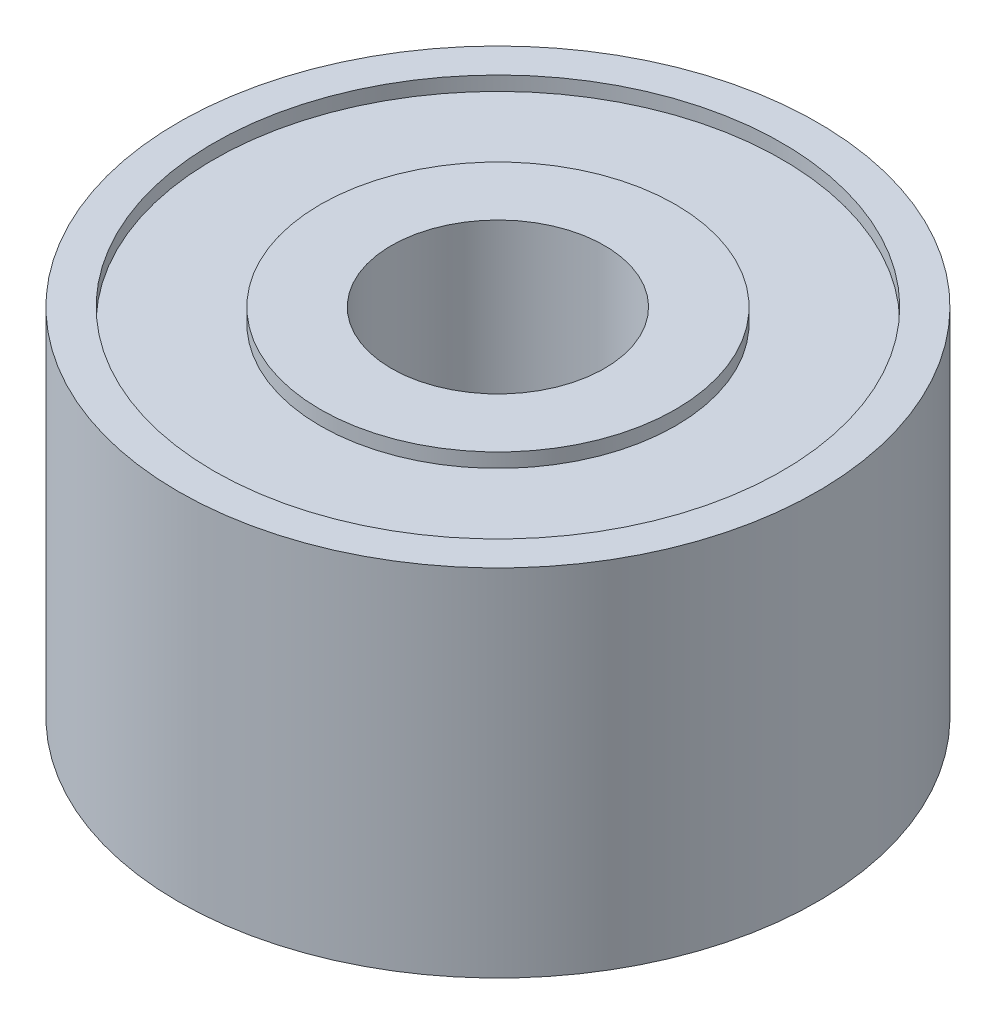
ISO-10303-21;
HEADER;
FILE_DESCRIPTION(('STEP AP214'),'2;1');
FILE_NAME('part.step','',(''),(''),'','','');
FILE_SCHEMA(('AUTOMOTIVE_DESIGN { 1 0 10303 214 1 1 1 1 }'));
ENDSEC;
DATA;
#1=APPLICATION_CONTEXT('core data for automotive mechanical design processes');
#2=APPLICATION_PROTOCOL_DEFINITION('international standard','automotive_design',2000,#1);
#3=PRODUCT_CONTEXT('',#1,'mechanical');
#4=PRODUCT('Part','Part','',(#3));
#5=PRODUCT_RELATED_PRODUCT_CATEGORY('part','',(#4));
#6=PRODUCT_DEFINITION_FORMATION('','',#4);
#7=PRODUCT_DEFINITION_CONTEXT('part definition',#1,'design');
#8=PRODUCT_DEFINITION('design','',#6,#7);
#9=PRODUCT_DEFINITION_SHAPE('','',#8);
#10=(LENGTH_UNIT() NAMED_UNIT(*) SI_UNIT(.MILLI.,.METRE.));
#11=(NAMED_UNIT(*) PLANE_ANGLE_UNIT() SI_UNIT($,.RADIAN.));
#12=(NAMED_UNIT(*) SI_UNIT($,.STERADIAN.) SOLID_ANGLE_UNIT());
#13=UNCERTAINTY_MEASURE_WITH_UNIT(LENGTH_MEASURE(1.E-05),#10,'distance_accuracy_value','');
#14=(GEOMETRIC_REPRESENTATION_CONTEXT(3) GLOBAL_UNCERTAINTY_ASSIGNED_CONTEXT((#13)) GLOBAL_UNIT_ASSIGNED_CONTEXT((#10,
#11,#12)) REPRESENTATION_CONTEXT('',''));
#15=CARTESIAN_POINT('',(0.,0.,0.));
#16=DIRECTION('',(0.,0.,1.));
#17=DIRECTION('',(1.,0.,0.));
#18=AXIS2_PLACEMENT_3D('',#15,#16,#17);
#19=CARTESIAN_POINT('',(0.,0.,0.));
#20=DIRECTION('',(0.,1.,0.));
#21=DIRECTION('',(0.,0.,1.));
#22=AXIS2_PLACEMENT_3D('',#19,#20,#21);
#23=PLANE('',#22);
#24=CARTESIAN_POINT('',(0.,0.,0.));
#25=DIRECTION('',(0.,1.,0.));
#26=DIRECTION('',(0.,0.,1.));
#27=AXIS2_PLACEMENT_3D('',#24,#25,#26);
#28=CIRCLE('',#27,1.5);
#29=CARTESIAN_POINT('',(0.,0.,1.5));
#30=VERTEX_POINT('',#29);
#31=EDGE_CURVE('E52',#30,#30,#28,.T.);
#32=ORIENTED_EDGE('',*,*,#31,.T.);
#33=EDGE_LOOP('',(#32));
#34=FACE_BOUND('',#33,.T.);
#35=CARTESIAN_POINT('',(0.,0.,0.));
#36=DIRECTION('',(0.,-1.,0.));
#37=DIRECTION('',(0.,0.,-1.));
#38=AXIS2_PLACEMENT_3D('',#35,#36,#37);
#39=CIRCLE('',#38,2.5);
#40=CARTESIAN_POINT('',(0.,0.,-2.5));
#41=VERTEX_POINT('',#40);
#42=EDGE_CURVE('E84',#41,#41,#39,.T.);
#43=ORIENTED_EDGE('',*,*,#42,.T.);
#44=EDGE_LOOP('',(#43));
#45=FACE_BOUND('',#44,.T.);
#46=ADVANCED_FACE('F37',(#34,#45),#23,.F.);
#47=CARTESIAN_POINT('',(0.,5.,0.));
#48=DIRECTION('',(0.,1.,0.));
#49=DIRECTION('',(0.,0.,1.));
#50=AXIS2_PLACEMENT_3D('',#47,#48,#49);
#51=PLANE('',#50);
#52=CARTESIAN_POINT('',(0.,5.,0.));
#53=DIRECTION('',(0.,1.,0.));
#54=DIRECTION('',(0.,0.,1.));
#55=AXIS2_PLACEMENT_3D('',#52,#53,#54);
#56=CIRCLE('',#55,1.5);
#57=CARTESIAN_POINT('',(0.,5.,1.5));
#58=VERTEX_POINT('',#57);
#59=EDGE_CURVE('E50',#58,#58,#56,.T.);
#60=ORIENTED_EDGE('',*,*,#59,.F.);
#61=EDGE_LOOP('',(#60));
#62=FACE_BOUND('',#61,.T.);
#63=CARTESIAN_POINT('',(0.,5.,0.));
#64=DIRECTION('',(0.,1.,0.));
#65=DIRECTION('',(0.,0.,1.));
#66=AXIS2_PLACEMENT_3D('',#63,#64,#65);
#67=CIRCLE('',#66,2.5);
#68=CARTESIAN_POINT('',(0.,5.,2.5));
#69=VERTEX_POINT('',#68);
#70=EDGE_CURVE('E68',#69,#69,#67,.T.);
#71=ORIENTED_EDGE('',*,*,#70,.T.);
#72=EDGE_LOOP('',(#71));
#73=FACE_BOUND('',#72,.T.);
#74=ADVANCED_FACE('F124',(#62,#73),#51,.T.);
#75=CARTESIAN_POINT('',(0.,5.,0.));
#76=DIRECTION('',(0.,1.,0.));
#77=DIRECTION('',(0.,0.,1.));
#78=AXIS2_PLACEMENT_3D('',#75,#76,#77);
#79=CIRCLE('',#78,4.);
#80=CARTESIAN_POINT('',(0.,5.,4.));
#81=VERTEX_POINT('',#80);
#82=EDGE_CURVE('E60',#81,#81,#79,.T.);
#83=ORIENTED_EDGE('',*,*,#82,.F.);
#84=EDGE_LOOP('',(#83));
#85=FACE_BOUND('',#84,.T.);
#86=CARTESIAN_POINT('',(0.,5.,0.));
#87=DIRECTION('',(0.,1.,0.));
#88=DIRECTION('',(0.,0.,1.));
#89=AXIS2_PLACEMENT_3D('',#86,#87,#88);
#90=CIRCLE('',#89,4.5);
#91=CARTESIAN_POINT('',(0.,5.,4.5));
#92=VERTEX_POINT('',#91);
#93=EDGE_CURVE('E10',#92,#92,#90,.T.);
#94=ORIENTED_EDGE('',*,*,#93,.T.);
#95=EDGE_LOOP('',(#94));
#96=FACE_BOUND('',#95,.T.);
#97=ADVANCED_FACE('F111',(#85,#96),#51,.T.);
#98=CARTESIAN_POINT('',(0.,0.,0.));
#99=DIRECTION('',(0.,-1.,0.));
#100=DIRECTION('',(0.,0.,-1.));
#101=AXIS2_PLACEMENT_3D('',#98,#99,#100);
#102=CIRCLE('',#101,4.);
#103=CARTESIAN_POINT('',(0.,0.,-4.));
#104=VERTEX_POINT('',#103);
#105=EDGE_CURVE('E76',#104,#104,#102,.T.);
#106=ORIENTED_EDGE('',*,*,#105,.F.);
#107=EDGE_LOOP('',(#106));
#108=FACE_BOUND('',#107,.T.);
#109=CARTESIAN_POINT('',(0.,0.,0.));
#110=DIRECTION('',(0.,1.,0.));
#111=DIRECTION('',(0.,0.,1.));
#112=AXIS2_PLACEMENT_3D('',#109,#110,#111);
#113=CIRCLE('',#112,4.5);
#114=CARTESIAN_POINT('',(0.,0.,4.5));
#115=VERTEX_POINT('',#114);
#116=EDGE_CURVE('E41',#115,#115,#113,.T.);
#117=ORIENTED_EDGE('',*,*,#116,.F.);
#118=EDGE_LOOP('',(#117));
#119=FACE_BOUND('',#118,.T.);
#120=ADVANCED_FACE('F108',(#108,#119),#23,.F.);
#121=CARTESIAN_POINT('',(0.,5.,0.));
#122=DIRECTION('',(0.,-1.,0.));
#123=DIRECTION('',(0.,0.,-1.));
#124=AXIS2_PLACEMENT_3D('',#121,#122,#123);
#125=CYLINDRICAL_SURFACE('',#124,4.5);
#126=ORIENTED_EDGE('',*,*,#93,.F.);
#127=EDGE_LOOP('',(#126));
#128=FACE_BOUND('',#127,.T.);
#129=ORIENTED_EDGE('',*,*,#116,.T.);
#130=EDGE_LOOP('',(#129));
#131=FACE_BOUND('',#130,.T.);
#132=ADVANCED_FACE('F39',(#128,#131),#125,.T.);
#133=CARTESIAN_POINT('',(0.,5.,0.));
#134=DIRECTION('',(0.,-1.,0.));
#135=DIRECTION('',(0.,0.,-1.));
#136=AXIS2_PLACEMENT_3D('',#133,#134,#135);
#137=CYLINDRICAL_SURFACE('',#136,1.5);
#138=ORIENTED_EDGE('',*,*,#59,.T.);
#139=EDGE_LOOP('',(#138));
#140=FACE_BOUND('',#139,.T.);
#141=ORIENTED_EDGE('',*,*,#31,.F.);
#142=EDGE_LOOP('',(#141));
#143=FACE_BOUND('',#142,.T.);
#144=ADVANCED_FACE('F115',(#140,#143),#137,.F.);
#145=CARTESIAN_POINT('',(0.,4.8,0.));
#146=DIRECTION('',(0.,1.,0.));
#147=DIRECTION('',(0.,0.,1.));
#148=AXIS2_PLACEMENT_3D('',#145,#146,#147);
#149=CYLINDRICAL_SURFACE('',#148,4.);
#150=CARTESIAN_POINT('',(0.,4.8,0.));
#151=DIRECTION('',(0.,1.,0.));
#152=DIRECTION('',(0.,0.,1.));
#153=AXIS2_PLACEMENT_3D('',#150,#151,#152);
#154=CIRCLE('',#153,4.);
#155=CARTESIAN_POINT('',(0.,4.8,4.));
#156=VERTEX_POINT('',#155);
#157=EDGE_CURVE('E56',#156,#156,#154,.T.);
#158=ORIENTED_EDGE('',*,*,#157,.F.);
#159=EDGE_LOOP('',(#158));
#160=FACE_BOUND('',#159,.T.);
#161=ORIENTED_EDGE('',*,*,#82,.T.);
#162=EDGE_LOOP('',(#161));
#163=FACE_BOUND('',#162,.T.);
#164=ADVANCED_FACE('F120',(#160,#163),#149,.F.);
#165=CARTESIAN_POINT('',(0.,4.8,0.));
#166=DIRECTION('',(0.,1.,0.));
#167=DIRECTION('',(0.,0.,1.));
#168=AXIS2_PLACEMENT_3D('',#165,#166,#167);
#169=PLANE('',#168);
#170=CARTESIAN_POINT('',(0.,4.8,0.));
#171=DIRECTION('',(0.,1.,0.));
#172=DIRECTION('',(0.,0.,1.));
#173=AXIS2_PLACEMENT_3D('',#170,#171,#172);
#174=CIRCLE('',#173,2.5);
#175=CARTESIAN_POINT('',(0.,4.8,2.5));
#176=VERTEX_POINT('',#175);
#177=EDGE_CURVE('E64',#176,#176,#174,.T.);
#178=ORIENTED_EDGE('',*,*,#177,.F.);
#179=EDGE_LOOP('',(#178));
#180=FACE_BOUND('',#179,.T.);
#181=ORIENTED_EDGE('',*,*,#157,.T.);
#182=EDGE_LOOP('',(#181));
#183=FACE_BOUND('',#182,.T.);
#184=ADVANCED_FACE('F137',(#180,#183),#169,.T.);
#185=CARTESIAN_POINT('',(0.,4.8,0.));
#186=DIRECTION('',(0.,1.,0.));
#187=DIRECTION('',(0.,0.,1.));
#188=AXIS2_PLACEMENT_3D('',#185,#186,#187);
#189=CYLINDRICAL_SURFACE('',#188,2.5);
#190=ORIENTED_EDGE('',*,*,#177,.T.);
#191=EDGE_LOOP('',(#190));
#192=FACE_BOUND('',#191,.T.);
#193=ORIENTED_EDGE('',*,*,#70,.F.);
#194=EDGE_LOOP('',(#193));
#195=FACE_BOUND('',#194,.T.);
#196=ADVANCED_FACE('F104',(#192,#195),#189,.T.);
#197=CARTESIAN_POINT('',(0.,0.2,0.));
#198=DIRECTION('',(0.,-1.,0.));
#199=DIRECTION('',(0.,0.,-1.));
#200=AXIS2_PLACEMENT_3D('',#197,#198,#199);
#201=CYLINDRICAL_SURFACE('',#200,4.);
#202=CARTESIAN_POINT('',(0.,0.2,0.));
#203=DIRECTION('',(0.,-1.,0.));
#204=DIRECTION('',(0.,0.,-1.));
#205=AXIS2_PLACEMENT_3D('',#202,#203,#204);
#206=CIRCLE('',#205,4.);
#207=CARTESIAN_POINT('',(0.,0.2,-4.));
#208=VERTEX_POINT('',#207);
#209=EDGE_CURVE('E72',#208,#208,#206,.T.);
#210=ORIENTED_EDGE('',*,*,#209,.F.);
#211=EDGE_LOOP('',(#210));
#212=FACE_BOUND('',#211,.T.);
#213=ORIENTED_EDGE('',*,*,#105,.T.);
#214=EDGE_LOOP('',(#213));
#215=FACE_BOUND('',#214,.T.);
#216=ADVANCED_FACE('F98',(#212,#215),#201,.F.);
#217=CARTESIAN_POINT('',(0.,0.2,0.));
#218=DIRECTION('',(0.,-1.,0.));
#219=DIRECTION('',(0.,0.,-1.));
#220=AXIS2_PLACEMENT_3D('',#217,#218,#219);
#221=PLANE('',#220);
#222=CARTESIAN_POINT('',(0.,0.2,0.));
#223=DIRECTION('',(0.,-1.,0.));
#224=DIRECTION('',(0.,0.,-1.));
#225=AXIS2_PLACEMENT_3D('',#222,#223,#224);
#226=CIRCLE('',#225,2.5);
#227=CARTESIAN_POINT('',(0.,0.2,-2.5));
#228=VERTEX_POINT('',#227);
#229=EDGE_CURVE('E80',#228,#228,#226,.T.);
#230=ORIENTED_EDGE('',*,*,#229,.F.);
#231=EDGE_LOOP('',(#230));
#232=FACE_BOUND('',#231,.T.);
#233=ORIENTED_EDGE('',*,*,#209,.T.);
#234=EDGE_LOOP('',(#233));
#235=FACE_BOUND('',#234,.T.);
#236=ADVANCED_FACE('F95',(#232,#235),#221,.T.);
#237=CARTESIAN_POINT('',(0.,0.2,0.));
#238=DIRECTION('',(0.,-1.,0.));
#239=DIRECTION('',(0.,0.,-1.));
#240=AXIS2_PLACEMENT_3D('',#237,#238,#239);
#241=CYLINDRICAL_SURFACE('',#240,2.5);
#242=ORIENTED_EDGE('',*,*,#229,.T.);
#243=EDGE_LOOP('',(#242));
#244=FACE_BOUND('',#243,.T.);
#245=ORIENTED_EDGE('',*,*,#42,.F.);
#246=EDGE_LOOP('',(#245));
#247=FACE_BOUND('',#246,.T.);
#248=ADVANCED_FACE('F92',(#244,#247),#241,.T.);
#249=CLOSED_SHELL('',(#46,#74,#97,#120,#132,#144,#164,#184,#196,#216,#236,#248));
#250=MANIFOLD_SOLID_BREP('B2',#249);
#251=ADVANCED_BREP_SHAPE_REPRESENTATION('',(#18,#250),#14);
#252=SHAPE_DEFINITION_REPRESENTATION(#9,#251);
ENDSEC;
END-ISO-10303-21;
